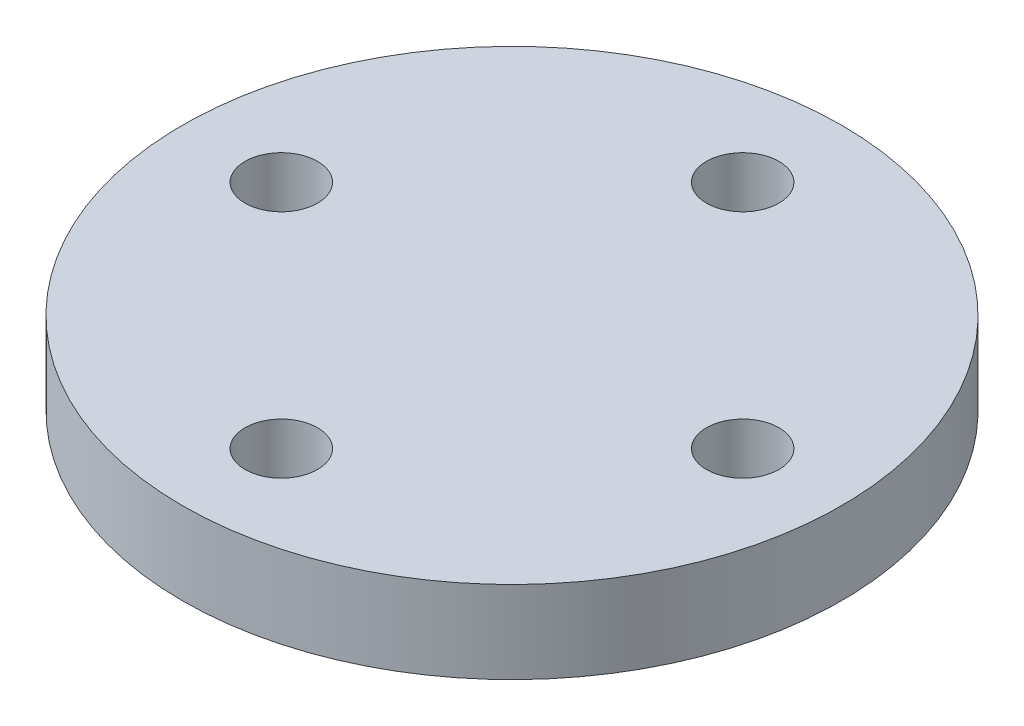
ISO-10303-21;
HEADER;
FILE_DESCRIPTION(('STEP AP214'),'2;1');
FILE_NAME('part.step','',(''),(''),'','','');
FILE_SCHEMA(('AUTOMOTIVE_DESIGN { 1 0 10303 214 1 1 1 1 }'));
ENDSEC;
DATA;
#1=APPLICATION_CONTEXT('core data for automotive mechanical design processes');
#2=APPLICATION_PROTOCOL_DEFINITION('international standard','automotive_design',2000,#1);
#3=PRODUCT_CONTEXT('',#1,'mechanical');
#4=PRODUCT('Part','Part','',(#3));
#5=PRODUCT_RELATED_PRODUCT_CATEGORY('part','',(#4));
#6=PRODUCT_DEFINITION_FORMATION('','',#4);
#7=PRODUCT_DEFINITION_CONTEXT('part definition',#1,'design');
#8=PRODUCT_DEFINITION('design','',#6,#7);
#9=PRODUCT_DEFINITION_SHAPE('','',#8);
#10=(LENGTH_UNIT() NAMED_UNIT(*) SI_UNIT(.MILLI.,.METRE.));
#11=(NAMED_UNIT(*) PLANE_ANGLE_UNIT() SI_UNIT($,.RADIAN.));
#12=(NAMED_UNIT(*) SI_UNIT($,.STERADIAN.) SOLID_ANGLE_UNIT());
#13=UNCERTAINTY_MEASURE_WITH_UNIT(LENGTH_MEASURE(1.E-05),#10,'distance_accuracy_value','');
#14=(GEOMETRIC_REPRESENTATION_CONTEXT(3) GLOBAL_UNCERTAINTY_ASSIGNED_CONTEXT((#13)) GLOBAL_UNIT_ASSIGNED_CONTEXT((#10,
#11,#12)) REPRESENTATION_CONTEXT('',''));
#15=CARTESIAN_POINT('',(0.,0.,0.));
#16=DIRECTION('',(0.,0.,1.));
#17=DIRECTION('',(1.,0.,0.));
#18=AXIS2_PLACEMENT_3D('',#15,#16,#17);
#19=CARTESIAN_POINT('',(0.,2.5,0.));
#20=DIRECTION('',(0.,1.,0.));
#21=DIRECTION('',(0.,0.,1.));
#22=AXIS2_PLACEMENT_3D('',#19,#20,#21);
#23=PLANE('',#22);
#24=CARTESIAN_POINT('',(0.,2.5,7.));
#25=DIRECTION('',(0.,1.,0.));
#26=DIRECTION('',(0.,0.,1.));
#27=AXIS2_PLACEMENT_3D('',#24,#25,#26);
#28=CIRCLE('',#27,1.1);
#29=CARTESIAN_POINT('',(0.,2.5,8.1));
#30=VERTEX_POINT('',#29);
#31=EDGE_CURVE('E70',#30,#30,#28,.T.);
#32=ORIENTED_EDGE('',*,*,#31,.F.);
#33=EDGE_LOOP('',(#32));
#34=FACE_BOUND('',#33,.T.);
#35=CARTESIAN_POINT('',(0.,2.5,-7.));
#36=DIRECTION('',(0.,1.,0.));
#37=DIRECTION('',(0.,0.,1.));
#38=AXIS2_PLACEMENT_3D('',#35,#36,#37);
#39=CIRCLE('',#38,1.1);
#40=CARTESIAN_POINT('',(0.,2.5,-5.9));
#41=VERTEX_POINT('',#40);
#42=EDGE_CURVE('E56',#41,#41,#39,.T.);
#43=ORIENTED_EDGE('',*,*,#42,.F.);
#44=EDGE_LOOP('',(#43));
#45=FACE_BOUND('',#44,.T.);
#46=CARTESIAN_POINT('',(0.,2.5,0.));
#47=DIRECTION('',(0.,1.,0.));
#48=DIRECTION('',(0.,0.,1.));
#49=AXIS2_PLACEMENT_3D('',#46,#47,#48);
#50=CIRCLE('',#49,10.);
#51=CARTESIAN_POINT('',(0.,2.5,10.));
#52=VERTEX_POINT('',#51);
#53=EDGE_CURVE('E10',#52,#52,#50,.T.);
#54=ORIENTED_EDGE('',*,*,#53,.T.);
#55=EDGE_LOOP('',(#54));
#56=FACE_BOUND('',#55,.T.);
#57=CARTESIAN_POINT('',(7.,2.5,0.));
#58=DIRECTION('',(0.,1.,0.));
#59=DIRECTION('',(0.,0.,1.));
#60=AXIS2_PLACEMENT_3D('',#57,#58,#59);
#61=CIRCLE('',#60,1.1);
#62=CARTESIAN_POINT('',(7.,2.5,1.1));
#63=VERTEX_POINT('',#62);
#64=EDGE_CURVE('E62',#63,#63,#61,.T.);
#65=ORIENTED_EDGE('',*,*,#64,.F.);
#66=EDGE_LOOP('',(#65));
#67=FACE_BOUND('',#66,.T.);
#68=CARTESIAN_POINT('',(-7.,2.5,0.));
#69=DIRECTION('',(0.,1.,0.));
#70=DIRECTION('',(0.,0.,1.));
#71=AXIS2_PLACEMENT_3D('',#68,#69,#70);
#72=CIRCLE('',#71,1.1);
#73=CARTESIAN_POINT('',(-7.,2.5,1.1));
#74=VERTEX_POINT('',#73);
#75=EDGE_CURVE('E78',#74,#74,#72,.T.);
#76=ORIENTED_EDGE('',*,*,#75,.F.);
#77=EDGE_LOOP('',(#76));
#78=FACE_BOUND('',#77,.T.);
#79=ADVANCED_FACE('F43',(#34,#45,#56,#67,#78),#23,.T.);
#80=CARTESIAN_POINT('',(0.,0.,0.));
#81=DIRECTION('',(0.,1.,0.));
#82=DIRECTION('',(0.,0.,1.));
#83=AXIS2_PLACEMENT_3D('',#80,#81,#82);
#84=PLANE('',#83);
#85=CARTESIAN_POINT('',(0.,0.,0.));
#86=DIRECTION('',(0.,1.,0.));
#87=DIRECTION('',(0.,0.,1.));
#88=AXIS2_PLACEMENT_3D('',#85,#86,#87);
#89=CIRCLE('',#88,10.);
#90=CARTESIAN_POINT('',(0.,0.,10.));
#91=VERTEX_POINT('',#90);
#92=EDGE_CURVE('E47',#91,#91,#89,.T.);
#93=ORIENTED_EDGE('',*,*,#92,.F.);
#94=EDGE_LOOP('',(#93));
#95=FACE_BOUND('',#94,.T.);
#96=CARTESIAN_POINT('',(0.,0.,-7.));
#97=DIRECTION('',(0.,1.,0.));
#98=DIRECTION('',(0.,0.,1.));
#99=AXIS2_PLACEMENT_3D('',#96,#97,#98);
#100=CIRCLE('',#99,1.1);
#101=CARTESIAN_POINT('',(0.,0.,-5.9));
#102=VERTEX_POINT('',#101);
#103=EDGE_CURVE('E58',#102,#102,#100,.T.);
#104=ORIENTED_EDGE('',*,*,#103,.T.);
#105=EDGE_LOOP('',(#104));
#106=FACE_BOUND('',#105,.T.);
#107=CARTESIAN_POINT('',(7.,0.,0.));
#108=DIRECTION('',(0.,1.,0.));
#109=DIRECTION('',(0.,0.,1.));
#110=AXIS2_PLACEMENT_3D('',#107,#108,#109);
#111=CIRCLE('',#110,1.1);
#112=CARTESIAN_POINT('',(7.,0.,1.1));
#113=VERTEX_POINT('',#112);
#114=EDGE_CURVE('E66',#113,#113,#111,.T.);
#115=ORIENTED_EDGE('',*,*,#114,.T.);
#116=EDGE_LOOP('',(#115));
#117=FACE_BOUND('',#116,.T.);
#118=CARTESIAN_POINT('',(0.,0.,7.));
#119=DIRECTION('',(0.,1.,0.));
#120=DIRECTION('',(0.,0.,1.));
#121=AXIS2_PLACEMENT_3D('',#118,#119,#120);
#122=CIRCLE('',#121,1.1);
#123=CARTESIAN_POINT('',(0.,0.,8.1));
#124=VERTEX_POINT('',#123);
#125=EDGE_CURVE('E74',#124,#124,#122,.T.);
#126=ORIENTED_EDGE('',*,*,#125,.T.);
#127=EDGE_LOOP('',(#126));
#128=FACE_BOUND('',#127,.T.);
#129=CARTESIAN_POINT('',(-7.,0.,0.));
#130=DIRECTION('',(0.,1.,0.));
#131=DIRECTION('',(0.,0.,1.));
#132=AXIS2_PLACEMENT_3D('',#129,#130,#131);
#133=CIRCLE('',#132,1.1);
#134=CARTESIAN_POINT('',(-7.,0.,1.1));
#135=VERTEX_POINT('',#134);
#136=EDGE_CURVE('E82',#135,#135,#133,.T.);
#137=ORIENTED_EDGE('',*,*,#136,.T.);
#138=EDGE_LOOP('',(#137));
#139=FACE_BOUND('',#138,.T.);
#140=ADVANCED_FACE('F94',(#95,#106,#117,#128,#139),#84,.F.);
#141=CARTESIAN_POINT('',(0.,2.5,0.));
#142=DIRECTION('',(0.,-1.,0.));
#143=DIRECTION('',(0.,0.,-1.));
#144=AXIS2_PLACEMENT_3D('',#141,#142,#143);
#145=CYLINDRICAL_SURFACE('',#144,10.);
#146=ORIENTED_EDGE('',*,*,#53,.F.);
#147=EDGE_LOOP('',(#146));
#148=FACE_BOUND('',#147,.T.);
#149=ORIENTED_EDGE('',*,*,#92,.T.);
#150=EDGE_LOOP('',(#149));
#151=FACE_BOUND('',#150,.T.);
#152=ADVANCED_FACE('F45',(#148,#151),#145,.T.);
#153=CARTESIAN_POINT('',(0.,2.5,-7.));
#154=DIRECTION('',(0.,-1.,0.));
#155=DIRECTION('',(0.,0.,-1.));
#156=AXIS2_PLACEMENT_3D('',#153,#154,#155);
#157=CYLINDRICAL_SURFACE('',#156,1.1);
#158=ORIENTED_EDGE('',*,*,#42,.T.);
#159=EDGE_LOOP('',(#158));
#160=FACE_BOUND('',#159,.T.);
#161=ORIENTED_EDGE('',*,*,#103,.F.);
#162=EDGE_LOOP('',(#161));
#163=FACE_BOUND('',#162,.T.);
#164=ADVANCED_FACE('F104',(#160,#163),#157,.F.);
#165=CARTESIAN_POINT('',(7.,2.5,0.));
#166=DIRECTION('',(0.,-1.,0.));
#167=DIRECTION('',(0.,0.,-1.));
#168=AXIS2_PLACEMENT_3D('',#165,#166,#167);
#169=CYLINDRICAL_SURFACE('',#168,1.1);
#170=ORIENTED_EDGE('',*,*,#64,.T.);
#171=EDGE_LOOP('',(#170));
#172=FACE_BOUND('',#171,.T.);
#173=ORIENTED_EDGE('',*,*,#114,.F.);
#174=EDGE_LOOP('',(#173));
#175=FACE_BOUND('',#174,.T.);
#176=ADVANCED_FACE('F107',(#172,#175),#169,.F.);
#177=CARTESIAN_POINT('',(0.,2.5,7.));
#178=DIRECTION('',(0.,-1.,0.));
#179=DIRECTION('',(0.,0.,-1.));
#180=AXIS2_PLACEMENT_3D('',#177,#178,#179);
#181=CYLINDRICAL_SURFACE('',#180,1.1);
#182=ORIENTED_EDGE('',*,*,#31,.T.);
#183=EDGE_LOOP('',(#182));
#184=FACE_BOUND('',#183,.T.);
#185=ORIENTED_EDGE('',*,*,#125,.F.);
#186=EDGE_LOOP('',(#185));
#187=FACE_BOUND('',#186,.T.);
#188=ADVANCED_FACE('F111',(#184,#187),#181,.F.);
#189=CARTESIAN_POINT('',(-7.,2.5,0.));
#190=DIRECTION('',(0.,-1.,0.));
#191=DIRECTION('',(0.,0.,-1.));
#192=AXIS2_PLACEMENT_3D('',#189,#190,#191);
#193=CYLINDRICAL_SURFACE('',#192,1.1);
#194=ORIENTED_EDGE('',*,*,#75,.T.);
#195=EDGE_LOOP('',(#194));
#196=FACE_BOUND('',#195,.T.);
#197=ORIENTED_EDGE('',*,*,#136,.F.);
#198=EDGE_LOOP('',(#197));
#199=FACE_BOUND('',#198,.T.);
#200=ADVANCED_FACE('F90',(#196,#199),#193,.F.);
#201=CLOSED_SHELL('',(#79,#140,#152,#164,#176,#188,#200));
#202=MANIFOLD_SOLID_BREP('B2',#201);
#203=ADVANCED_BREP_SHAPE_REPRESENTATION('',(#18,#202),#14);
#204=SHAPE_DEFINITION_REPRESENTATION(#9,#203);
ENDSEC;
END-ISO-10303-21;
